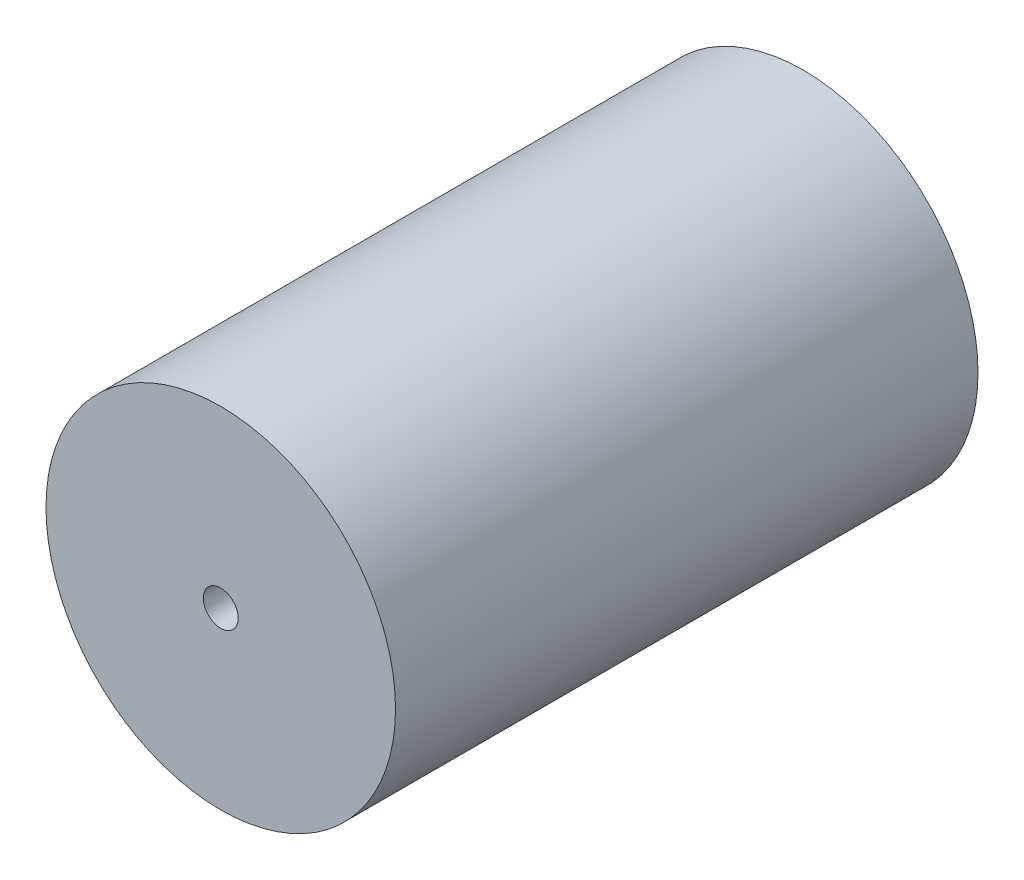
ISO-10303-21;
HEADER;
FILE_DESCRIPTION(('STEP AP214'),'2;1');
FILE_NAME('part.step','',(''),(''),'','','');
FILE_SCHEMA(('AUTOMOTIVE_DESIGN { 1 0 10303 214 1 1 1 1 }'));
ENDSEC;
DATA;
#1=APPLICATION_CONTEXT('core data for automotive mechanical design processes');
#2=APPLICATION_PROTOCOL_DEFINITION('international standard','automotive_design',2000,#1);
#3=PRODUCT_CONTEXT('',#1,'mechanical');
#4=PRODUCT('Part','Part','',(#3));
#5=PRODUCT_RELATED_PRODUCT_CATEGORY('part','',(#4));
#6=PRODUCT_DEFINITION_FORMATION('','',#4);
#7=PRODUCT_DEFINITION_CONTEXT('part definition',#1,'design');
#8=PRODUCT_DEFINITION('design','',#6,#7);
#9=PRODUCT_DEFINITION_SHAPE('','',#8);
#10=(LENGTH_UNIT() NAMED_UNIT(*) SI_UNIT(.MILLI.,.METRE.));
#11=(NAMED_UNIT(*) PLANE_ANGLE_UNIT() SI_UNIT($,.RADIAN.));
#12=(NAMED_UNIT(*) SI_UNIT($,.STERADIAN.) SOLID_ANGLE_UNIT());
#13=UNCERTAINTY_MEASURE_WITH_UNIT(LENGTH_MEASURE(1.E-05),#10,'distance_accuracy_value','');
#14=(GEOMETRIC_REPRESENTATION_CONTEXT(3) GLOBAL_UNCERTAINTY_ASSIGNED_CONTEXT((#13)) GLOBAL_UNIT_ASSIGNED_CONTEXT((#10,
#11,#12)) REPRESENTATION_CONTEXT('',''));
#15=CARTESIAN_POINT('',(0.,0.,0.));
#16=DIRECTION('',(0.,0.,1.));
#17=DIRECTION('',(1.,0.,0.));
#18=AXIS2_PLACEMENT_3D('',#15,#16,#17);
#19=CARTESIAN_POINT('',(0.,5.61661746539475,500.));
#20=DIRECTION('',(0.,0.,1.));
#21=DIRECTION('',(1.,0.,0.));
#22=AXIS2_PLACEMENT_3D('',#19,#20,#21);
#23=PLANE('',#22);
#24=CARTESIAN_POINT('',(0.,5.61661746539475,500.));
#25=DIRECTION('',(0.,0.,1.));
#26=DIRECTION('',(1.,0.,0.));
#27=AXIS2_PLACEMENT_3D('',#24,#25,#26);
#28=CIRCLE('',#27,150.);
#29=CARTESIAN_POINT('',(150.,5.61661746539475,500.));
#30=VERTEX_POINT('',#29);
#31=EDGE_CURVE('E10',#30,#30,#28,.T.);
#32=ORIENTED_EDGE('',*,*,#31,.T.);
#33=EDGE_LOOP('',(#32));
#34=FACE_BOUND('',#33,.T.);
#35=CARTESIAN_POINT('',(0.,5.61661746539475,500.));
#36=DIRECTION('',(0.,0.,1.));
#37=DIRECTION('',(1.,0.,0.));
#38=AXIS2_PLACEMENT_3D('',#35,#36,#37);
#39=CIRCLE('',#38,15.);
#40=CARTESIAN_POINT('',(15.,5.61661746539475,500.));
#41=VERTEX_POINT('',#40);
#42=EDGE_CURVE('E48',#41,#41,#39,.T.);
#43=ORIENTED_EDGE('',*,*,#42,.F.);
#44=EDGE_LOOP('',(#43));
#45=FACE_BOUND('',#44,.T.);
#46=ADVANCED_FACE('F40',(#34,#45),#23,.T.);
#47=CARTESIAN_POINT('',(0.,5.61661746539475,0.));
#48=DIRECTION('',(0.,0.,1.));
#49=DIRECTION('',(1.,0.,0.));
#50=AXIS2_PLACEMENT_3D('',#47,#48,#49);
#51=PLANE('',#50);
#52=CARTESIAN_POINT('',(0.,5.61661746539475,0.));
#53=DIRECTION('',(0.,0.,1.));
#54=DIRECTION('',(1.,0.,0.));
#55=AXIS2_PLACEMENT_3D('',#52,#53,#54);
#56=CIRCLE('',#55,150.);
#57=CARTESIAN_POINT('',(150.,5.61661746539475,0.));
#58=VERTEX_POINT('',#57);
#59=EDGE_CURVE('E41',#58,#58,#56,.T.);
#60=ORIENTED_EDGE('',*,*,#59,.F.);
#61=EDGE_LOOP('',(#60));
#62=FACE_BOUND('',#61,.T.);
#63=CARTESIAN_POINT('',(0.,5.61661746539475,0.));
#64=DIRECTION('',(0.,0.,1.));
#65=DIRECTION('',(1.,0.,0.));
#66=AXIS2_PLACEMENT_3D('',#63,#64,#65);
#67=CIRCLE('',#66,15.);
#68=CARTESIAN_POINT('',(15.,5.61661746539475,0.));
#69=VERTEX_POINT('',#68);
#70=EDGE_CURVE('E49',#69,#69,#67,.T.);
#71=ORIENTED_EDGE('',*,*,#70,.T.);
#72=EDGE_LOOP('',(#71));
#73=FACE_BOUND('',#72,.T.);
#74=ADVANCED_FACE('F58',(#62,#73),#51,.F.);
#75=CARTESIAN_POINT('',(0.,5.61661746539475,500.));
#76=DIRECTION('',(0.,0.,-1.));
#77=DIRECTION('',(-1.,0.,0.));
#78=AXIS2_PLACEMENT_3D('',#75,#76,#77);
#79=CYLINDRICAL_SURFACE('',#78,150.);
#80=ORIENTED_EDGE('',*,*,#31,.F.);
#81=EDGE_LOOP('',(#80));
#82=FACE_BOUND('',#81,.T.);
#83=ORIENTED_EDGE('',*,*,#59,.T.);
#84=EDGE_LOOP('',(#83));
#85=FACE_BOUND('',#84,.T.);
#86=ADVANCED_FACE('F39',(#82,#85),#79,.T.);
#87=CARTESIAN_POINT('',(0.,5.61661746539475,500.));
#88=DIRECTION('',(0.,0.,-1.));
#89=DIRECTION('',(-1.,0.,0.));
#90=AXIS2_PLACEMENT_3D('',#87,#88,#89);
#91=CYLINDRICAL_SURFACE('',#90,15.);
#92=ORIENTED_EDGE('',*,*,#42,.T.);
#93=EDGE_LOOP('',(#92));
#94=FACE_BOUND('',#93,.T.);
#95=ORIENTED_EDGE('',*,*,#70,.F.);
#96=EDGE_LOOP('',(#95));
#97=FACE_BOUND('',#96,.T.);
#98=ADVANCED_FACE('F57',(#94,#97),#91,.F.);
#99=CLOSED_SHELL('',(#46,#74,#86,#98));
#100=MANIFOLD_SOLID_BREP('B2',#99);
#101=ADVANCED_BREP_SHAPE_REPRESENTATION('',(#18,#100),#14);
#102=SHAPE_DEFINITION_REPRESENTATION(#9,#101);
ENDSEC;
END-ISO-10303-21;
